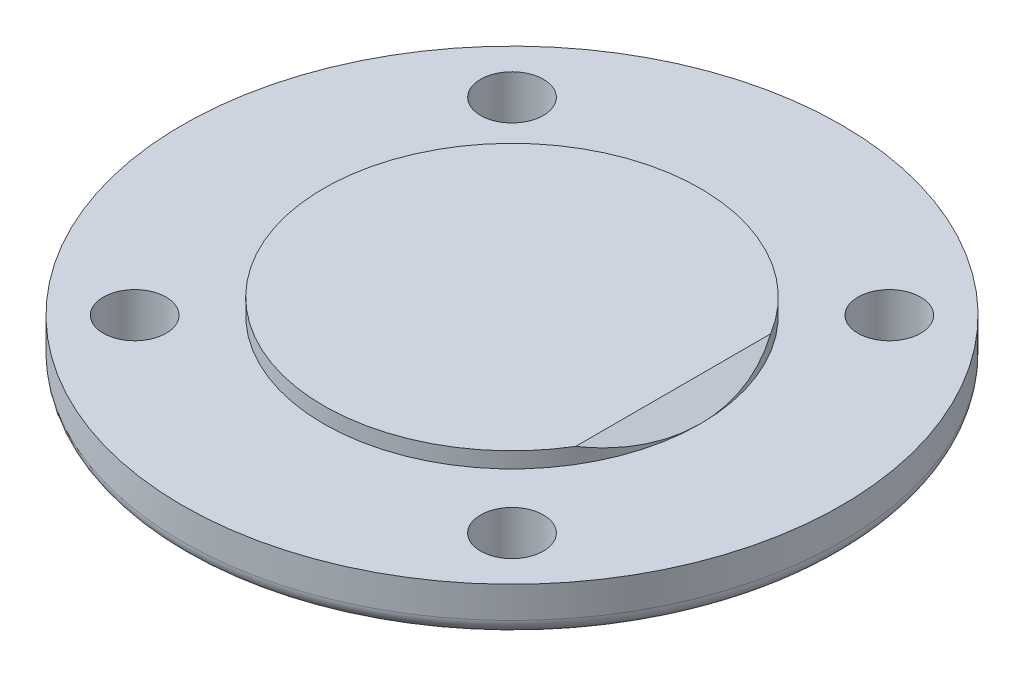
ISO-10303-21;
HEADER;
FILE_DESCRIPTION(('STEP AP214'),'2;1');
FILE_NAME('part.step','',(''),(''),'','','');
FILE_SCHEMA(('AUTOMOTIVE_DESIGN { 1 0 10303 214 1 1 1 1 }'));
ENDSEC;
DATA;
#1=APPLICATION_CONTEXT('core data for automotive mechanical design processes');
#2=APPLICATION_PROTOCOL_DEFINITION('international standard','automotive_design',2000,#1);
#3=PRODUCT_CONTEXT('',#1,'mechanical');
#4=PRODUCT('Part','Part','',(#3));
#5=PRODUCT_RELATED_PRODUCT_CATEGORY('part','',(#4));
#6=PRODUCT_DEFINITION_FORMATION('','',#4);
#7=PRODUCT_DEFINITION_CONTEXT('part definition',#1,'design');
#8=PRODUCT_DEFINITION('design','',#6,#7);
#9=PRODUCT_DEFINITION_SHAPE('','',#8);
#10=(LENGTH_UNIT() NAMED_UNIT(*) SI_UNIT(.MILLI.,.METRE.));
#11=(NAMED_UNIT(*) PLANE_ANGLE_UNIT() SI_UNIT($,.RADIAN.));
#12=(NAMED_UNIT(*) SI_UNIT($,.STERADIAN.) SOLID_ANGLE_UNIT());
#13=UNCERTAINTY_MEASURE_WITH_UNIT(LENGTH_MEASURE(1.E-05),#10,'distance_accuracy_value','');
#14=(GEOMETRIC_REPRESENTATION_CONTEXT(3) GLOBAL_UNCERTAINTY_ASSIGNED_CONTEXT((#13)) GLOBAL_UNIT_ASSIGNED_CONTEXT((#10,
#11,#12)) REPRESENTATION_CONTEXT('',''));
#15=CARTESIAN_POINT('',(0.,0.,0.));
#16=DIRECTION('',(0.,0.,1.));
#17=DIRECTION('',(1.,0.,0.));
#18=AXIS2_PLACEMENT_3D('',#15,#16,#17);
#19=CARTESIAN_POINT('',(0.,3.,0.));
#20=DIRECTION('',(0.,-1.,0.));
#21=DIRECTION('',(0.,0.,-1.));
#22=AXIS2_PLACEMENT_3D('',#19,#20,#21);
#23=CYLINDRICAL_SURFACE('',#22,21.);
#24=CARTESIAN_POINT('',(0.,1.,0.));
#25=DIRECTION('',(0.,1.,0.));
#26=DIRECTION('',(0.,0.,1.));
#27=AXIS2_PLACEMENT_3D('',#24,#25,#26);
#28=CIRCLE('',#27,21.);
#29=CARTESIAN_POINT('',(0.,1.,21.));
#30=VERTEX_POINT('',#29);
#31=EDGE_CURVE('E43',#30,#30,#28,.T.);
#32=ORIENTED_EDGE('',*,*,#31,.T.);
#33=EDGE_LOOP('',(#32));
#34=FACE_BOUND('',#33,.T.);
#35=CARTESIAN_POINT('',(0.,3.,0.));
#36=DIRECTION('',(0.,1.,0.));
#37=DIRECTION('',(0.,0.,1.));
#38=AXIS2_PLACEMENT_3D('',#35,#36,#37);
#39=CIRCLE('',#38,21.);
#40=CARTESIAN_POINT('',(0.,3.,21.));
#41=VERTEX_POINT('',#40);
#42=EDGE_CURVE('E71',#41,#41,#39,.T.);
#43=ORIENTED_EDGE('',*,*,#42,.F.);
#44=EDGE_LOOP('',(#43));
#45=FACE_BOUND('',#44,.T.);
#46=ADVANCED_FACE('F35',(#34,#45),#23,.T.);
#47=CARTESIAN_POINT('',(0.,3.,0.));
#48=DIRECTION('',(0.,1.,0.));
#49=DIRECTION('',(0.,0.,1.));
#50=AXIS2_PLACEMENT_3D('',#47,#48,#49);
#51=PLANE('',#50);
#52=CARTESIAN_POINT('',(12.0208152801712,3.,-12.0208152801714));
#53=DIRECTION('',(0.,1.,0.));
#54=DIRECTION('',(0.,0.,1.));
#55=AXIS2_PLACEMENT_3D('',#52,#53,#54);
#56=CIRCLE('',#55,2.);
#57=CARTESIAN_POINT('',(12.0208152801712,3.,-10.0208152801714));
#58=VERTEX_POINT('',#57);
#59=EDGE_CURVE('E155',#58,#58,#56,.T.);
#60=ORIENTED_EDGE('',*,*,#59,.F.);
#61=EDGE_LOOP('',(#60));
#62=FACE_BOUND('',#61,.T.);
#63=CARTESIAN_POINT('',(0.,3.,0.));
#64=DIRECTION('',(0.,1.,0.));
#65=DIRECTION('',(0.,0.,1.));
#66=AXIS2_PLACEMENT_3D('',#63,#64,#65);
#67=CIRCLE('',#66,12.);
#68=CARTESIAN_POINT('',(12.,3.,0.));
#69=VERTEX_POINT('',#68);
#70=EDGE_CURVE('E67',#69,#69,#67,.T.);
#71=ORIENTED_EDGE('',*,*,#70,.F.);
#72=EDGE_LOOP('',(#71));
#73=FACE_BOUND('',#72,.T.);
#74=CARTESIAN_POINT('',(12.0208152801715,3.,12.0208152801711));
#75=DIRECTION('',(0.,1.,0.));
#76=DIRECTION('',(-1.,0.,0.));
#77=AXIS2_PLACEMENT_3D('',#74,#75,#76);
#78=CIRCLE('',#77,2.);
#79=CARTESIAN_POINT('',(10.0208152801715,3.,12.0208152801711));
#80=VERTEX_POINT('',#79);
#81=EDGE_CURVE('E68',#80,#80,#78,.T.);
#82=ORIENTED_EDGE('',*,*,#81,.F.);
#83=EDGE_LOOP('',(#82));
#84=FACE_BOUND('',#83,.T.);
#85=ORIENTED_EDGE('',*,*,#42,.T.);
#86=EDGE_LOOP('',(#85));
#87=FACE_BOUND('',#86,.T.);
#88=CARTESIAN_POINT('',(-12.0208152801714,3.,-12.0208152801712));
#89=DIRECTION('',(0.,1.,0.));
#90=DIRECTION('',(1.,0.,0.));
#91=AXIS2_PLACEMENT_3D('',#88,#89,#90);
#92=CIRCLE('',#91,2.);
#93=CARTESIAN_POINT('',(-10.0208152801714,3.,-12.0208152801712));
#94=VERTEX_POINT('',#93);
#95=EDGE_CURVE('E144',#94,#94,#92,.T.);
#96=ORIENTED_EDGE('',*,*,#95,.F.);
#97=EDGE_LOOP('',(#96));
#98=FACE_BOUND('',#97,.T.);
#99=CARTESIAN_POINT('',(-12.0208152801712,3.,12.0208152801714));
#100=DIRECTION('',(0.,1.,0.));
#101=DIRECTION('',(0.,0.,-1.));
#102=AXIS2_PLACEMENT_3D('',#99,#100,#101);
#103=CIRCLE('',#102,2.);
#104=CARTESIAN_POINT('',(-12.0208152801712,3.,10.0208152801714));
#105=VERTEX_POINT('',#104);
#106=EDGE_CURVE('E140',#105,#105,#103,.T.);
#107=ORIENTED_EDGE('',*,*,#106,.F.);
#108=EDGE_LOOP('',(#107));
#109=FACE_BOUND('',#108,.T.);
#110=ADVANCED_FACE('F99',(#62,#73,#84,#87,#98,#109),#51,.T.);
#111=CARTESIAN_POINT('',(0.,0.,0.));
#112=DIRECTION('',(0.,1.,0.));
#113=DIRECTION('',(0.,0.,1.));
#114=AXIS2_PLACEMENT_3D('',#111,#112,#113);
#115=PLANE('',#114);
#116=CARTESIAN_POINT('',(0.,0.,0.));
#117=DIRECTION('',(0.,1.,0.));
#118=DIRECTION('',(0.,0.,1.));
#119=AXIS2_PLACEMENT_3D('',#116,#117,#118);
#120=CIRCLE('',#119,20.);
#121=CARTESIAN_POINT('',(0.,0.,20.));
#122=VERTEX_POINT('',#121);
#123=EDGE_CURVE('E11',#122,#122,#120,.F.);
#124=ORIENTED_EDGE('',*,*,#123,.T.);
#125=EDGE_LOOP('',(#124));
#126=FACE_BOUND('',#125,.T.);
#127=CARTESIAN_POINT('',(-12.0208152801714,0.,-12.0208152801712));
#128=DIRECTION('',(0.,1.,0.));
#129=DIRECTION('',(1.,0.,0.));
#130=AXIS2_PLACEMENT_3D('',#127,#128,#129);
#131=CIRCLE('',#130,2.);
#132=CARTESIAN_POINT('',(-10.0208152801714,0.,-12.0208152801712));
#133=VERTEX_POINT('',#132);
#134=EDGE_CURVE('E157',#133,#133,#131,.T.);
#135=ORIENTED_EDGE('',*,*,#134,.T.);
#136=EDGE_LOOP('',(#135));
#137=FACE_BOUND('',#136,.T.);
#138=CARTESIAN_POINT('',(-12.0208152801712,0.,12.0208152801714));
#139=DIRECTION('',(0.,1.,0.));
#140=DIRECTION('',(0.,0.,-1.));
#141=AXIS2_PLACEMENT_3D('',#138,#139,#140);
#142=CIRCLE('',#141,2.);
#143=CARTESIAN_POINT('',(-12.0208152801712,0.,10.0208152801714));
#144=VERTEX_POINT('',#143);
#145=EDGE_CURVE('E137',#144,#144,#142,.T.);
#146=ORIENTED_EDGE('',*,*,#145,.T.);
#147=EDGE_LOOP('',(#146));
#148=FACE_BOUND('',#147,.T.);
#149=CARTESIAN_POINT('',(12.0208152801715,0.,12.0208152801711));
#150=DIRECTION('',(0.,1.,0.));
#151=DIRECTION('',(-1.,0.,0.));
#152=AXIS2_PLACEMENT_3D('',#149,#150,#151);
#153=CIRCLE('',#152,2.);
#154=CARTESIAN_POINT('',(10.0208152801715,0.,12.0208152801711));
#155=VERTEX_POINT('',#154);
#156=EDGE_CURVE('E142',#155,#155,#153,.T.);
#157=ORIENTED_EDGE('',*,*,#156,.T.);
#158=EDGE_LOOP('',(#157));
#159=FACE_BOUND('',#158,.T.);
#160=CARTESIAN_POINT('',(12.0208152801712,0.,-12.0208152801714));
#161=DIRECTION('',(0.,1.,0.));
#162=DIRECTION('',(0.,0.,1.));
#163=AXIS2_PLACEMENT_3D('',#160,#161,#162);
#164=CIRCLE('',#163,2.);
#165=CARTESIAN_POINT('',(12.0208152801712,0.,-10.0208152801714));
#166=VERTEX_POINT('',#165);
#167=EDGE_CURVE('E152',#166,#166,#164,.T.);
#168=ORIENTED_EDGE('',*,*,#167,.T.);
#169=EDGE_LOOP('',(#168));
#170=FACE_BOUND('',#169,.T.);
#171=CARTESIAN_POINT('',(0.,0.,0.));
#172=DIRECTION('',(0.,1.,0.));
#173=DIRECTION('',(0.,0.,1.));
#174=AXIS2_PLACEMENT_3D('',#171,#172,#173);
#175=CIRCLE('',#174,12.);
#176=CARTESIAN_POINT('',(0.,0.,12.));
#177=VERTEX_POINT('',#176);
#178=EDGE_CURVE('E77',#177,#177,#175,.T.);
#179=ORIENTED_EDGE('',*,*,#178,.T.);
#180=EDGE_LOOP('',(#179));
#181=FACE_BOUND('',#180,.T.);
#182=ADVANCED_FACE('F103',(#126,#137,#148,#159,#170,#181),#115,.F.);
#183=CARTESIAN_POINT('',(0.,4.,0.));
#184=DIRECTION('',(0.,-1.,0.));
#185=DIRECTION('',(0.,0.,-1.));
#186=AXIS2_PLACEMENT_3D('',#183,#184,#185);
#187=CYLINDRICAL_SURFACE('',#186,12.);
#188=ORIENTED_EDGE('',*,*,#70,.T.);
#189=CARTESIAN_POINT('',(0.,9.92820323027554,0.));
#190=DIRECTION('',(-0.500000000000001,-0.866025403784438,0.));
#191=DIRECTION('',(0.866025403784438,-0.500000000000001,0.));
#192=AXIS2_PLACEMENT_3D('',#189,#190,#191);
#193=ELLIPSE('',#192,13.856406460551,12.);
#194=CARTESIAN_POINT('',(10.2679491924311,4.,6.21041217486029));
#195=VERTEX_POINT('',#194);
#196=EDGE_CURVE('E54',#69,#195,#193,.T.);
#197=ORIENTED_EDGE('',*,*,#196,.T.);
#198=CARTESIAN_POINT('',(0.,4.,0.));
#199=DIRECTION('',(0.,1.,0.));
#200=DIRECTION('',(0.,0.,1.));
#201=AXIS2_PLACEMENT_3D('',#198,#199,#200);
#202=CIRCLE('',#201,12.);
#203=CARTESIAN_POINT('',(10.2679491924311,4.,-6.21041217486029));
#204=VERTEX_POINT('',#203);
#205=EDGE_CURVE('E65',#204,#195,#202,.T.);
#206=ORIENTED_EDGE('',*,*,#205,.F.);
#207=EDGE_CURVE('E50',#204,#69,#193,.T.);
#208=ORIENTED_EDGE('',*,*,#207,.T.);
#209=EDGE_LOOP('',(#188,#197,#206,#208));
#210=FACE_BOUND('',#209,.T.);
#211=ADVANCED_FACE('F64',(#210),#187,.T.);
#212=CARTESIAN_POINT('',(0.,4.,0.));
#213=DIRECTION('',(0.,1.,0.));
#214=DIRECTION('',(0.,0.,1.));
#215=AXIS2_PLACEMENT_3D('',#212,#213,#214);
#216=PLANE('',#215);
#217=DIRECTION('',(0.,0.,1.));
#218=VECTOR('',#217,1.);
#219=CARTESIAN_POINT('',(10.2679491924311,4.,-35.5));
#220=LINE('',#219,#218);
#221=EDGE_CURVE('E56',#204,#195,#220,.T.);
#222=ORIENTED_EDGE('',*,*,#221,.F.);
#223=ORIENTED_EDGE('',*,*,#205,.T.);
#224=EDGE_LOOP('',(#222,#223));
#225=FACE_BOUND('',#224,.T.);
#226=ADVANCED_FACE('F70',(#225),#216,.T.);
#227=CARTESIAN_POINT('',(0.,1.,0.));
#228=DIRECTION('',(0.,-1.,0.));
#229=DIRECTION('',(0.,0.,-1.));
#230=AXIS2_PLACEMENT_3D('',#227,#228,#229);
#231=CYLINDRICAL_SURFACE('',#230,12.);
#232=CARTESIAN_POINT('',(0.,1.,0.));
#233=DIRECTION('',(0.,1.,0.));
#234=DIRECTION('',(0.,0.,1.));
#235=AXIS2_PLACEMENT_3D('',#232,#233,#234);
#236=CIRCLE('',#235,12.);
#237=CARTESIAN_POINT('',(0.,1.,12.));
#238=VERTEX_POINT('',#237);
#239=EDGE_CURVE('E72',#238,#238,#236,.T.);
#240=ORIENTED_EDGE('',*,*,#239,.T.);
#241=EDGE_LOOP('',(#240));
#242=FACE_BOUND('',#241,.T.);
#243=ORIENTED_EDGE('',*,*,#178,.F.);
#244=EDGE_LOOP('',(#243));
#245=FACE_BOUND('',#244,.T.);
#246=ADVANCED_FACE('F114',(#242,#245),#231,.F.);
#247=CARTESIAN_POINT('',(0.,1.,0.));
#248=DIRECTION('',(0.,1.,0.));
#249=DIRECTION('',(0.,0.,1.));
#250=AXIS2_PLACEMENT_3D('',#247,#248,#249);
#251=PLANE('',#250);
#252=ORIENTED_EDGE('',*,*,#239,.F.);
#253=EDGE_LOOP('',(#252));
#254=FACE_BOUND('',#253,.T.);
#255=ADVANCED_FACE('F117',(#254),#251,.F.);
#256=CARTESIAN_POINT('',(12.0208152801712,0.,-12.0208152801714));
#257=DIRECTION('',(0.,1.,0.));
#258=DIRECTION('',(0.,0.,1.));
#259=AXIS2_PLACEMENT_3D('',#256,#257,#258);
#260=CYLINDRICAL_SURFACE('',#259,2.);
#261=ORIENTED_EDGE('',*,*,#167,.F.);
#262=EDGE_LOOP('',(#261));
#263=FACE_BOUND('',#262,.T.);
#264=ORIENTED_EDGE('',*,*,#59,.T.);
#265=EDGE_LOOP('',(#264));
#266=FACE_BOUND('',#265,.T.);
#267=ADVANCED_FACE('F121',(#263,#266),#260,.F.);
#268=CARTESIAN_POINT('',(12.0208152801715,0.,12.0208152801711));
#269=DIRECTION('',(0.,1.,0.));
#270=DIRECTION('',(0.,0.,1.));
#271=AXIS2_PLACEMENT_3D('',#268,#269,#270);
#272=CYLINDRICAL_SURFACE('',#271,2.);
#273=ORIENTED_EDGE('',*,*,#156,.F.);
#274=EDGE_LOOP('',(#273));
#275=FACE_BOUND('',#274,.T.);
#276=ORIENTED_EDGE('',*,*,#81,.T.);
#277=EDGE_LOOP('',(#276));
#278=FACE_BOUND('',#277,.T.);
#279=ADVANCED_FACE('F125',(#275,#278),#272,.F.);
#280=CARTESIAN_POINT('',(-12.0208152801712,0.,12.0208152801714));
#281=DIRECTION('',(0.,1.,0.));
#282=DIRECTION('',(0.,0.,1.));
#283=AXIS2_PLACEMENT_3D('',#280,#281,#282);
#284=CYLINDRICAL_SURFACE('',#283,2.);
#285=ORIENTED_EDGE('',*,*,#145,.F.);
#286=EDGE_LOOP('',(#285));
#287=FACE_BOUND('',#286,.T.);
#288=ORIENTED_EDGE('',*,*,#106,.T.);
#289=EDGE_LOOP('',(#288));
#290=FACE_BOUND('',#289,.T.);
#291=ADVANCED_FACE('F94',(#287,#290),#284,.F.);
#292=CARTESIAN_POINT('',(-12.0208152801714,0.,-12.0208152801712));
#293=DIRECTION('',(0.,1.,0.));
#294=DIRECTION('',(0.,0.,1.));
#295=AXIS2_PLACEMENT_3D('',#292,#293,#294);
#296=CYLINDRICAL_SURFACE('',#295,2.);
#297=ORIENTED_EDGE('',*,*,#134,.F.);
#298=EDGE_LOOP('',(#297));
#299=FACE_BOUND('',#298,.T.);
#300=ORIENTED_EDGE('',*,*,#95,.T.);
#301=EDGE_LOOP('',(#300));
#302=FACE_BOUND('',#301,.T.);
#303=ADVANCED_FACE('F87',(#299,#302),#296,.F.);
#304=CARTESIAN_POINT('',(0.,1.,0.));
#305=DIRECTION('',(0.,1.,0.));
#306=DIRECTION('',(0.,0.,1.));
#307=AXIS2_PLACEMENT_3D('',#304,#305,#306);
#308=TOROIDAL_SURFACE('',#307,20.,1.);
#309=ORIENTED_EDGE('',*,*,#123,.F.);
#310=EDGE_LOOP('',(#309));
#311=FACE_BOUND('',#310,.T.);
#312=ORIENTED_EDGE('',*,*,#31,.F.);
#313=EDGE_LOOP('',(#312));
#314=FACE_BOUND('',#313,.T.);
#315=ADVANCED_FACE('F37',(#311,#314),#308,.T.);
#316=CARTESIAN_POINT('',(12.,3.,-35.5));
#317=DIRECTION('',(-0.500000000000001,-0.866025403784438,0.));
#318=DIRECTION('',(0.866025403784438,-0.500000000000001,0.));
#319=AXIS2_PLACEMENT_3D('',#316,#317,#318);
#320=PLANE('',#319);
#321=ORIENTED_EDGE('',*,*,#207,.F.);
#322=ORIENTED_EDGE('',*,*,#221,.T.);
#323=ORIENTED_EDGE('',*,*,#196,.F.);
#324=EDGE_LOOP('',(#321,#322,#323));
#325=FACE_BOUND('',#324,.T.);
#326=ADVANCED_FACE('F57',(#325),#320,.F.);
#327=CLOSED_SHELL('',(#46,#110,#182,#211,#226,#246,#255,#267,#279,#291,#303,#315,#326));
#328=MANIFOLD_SOLID_BREP('B2',#327);
#329=ADVANCED_BREP_SHAPE_REPRESENTATION('',(#18,#328),#14);
#330=SHAPE_DEFINITION_REPRESENTATION(#9,#329);
ENDSEC;
END-ISO-10303-21;
